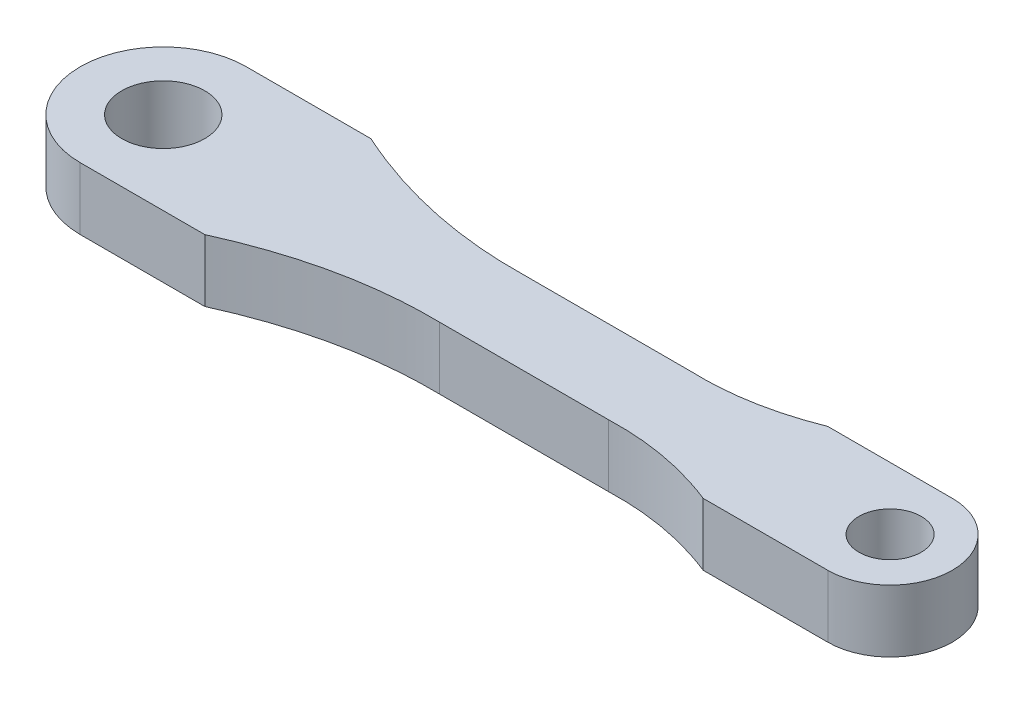
ISO-10303-21;
HEADER;
FILE_DESCRIPTION(('STEP AP214'),'2;1');
FILE_NAME('part.step','',(''),(''),'','','');
FILE_SCHEMA(('AUTOMOTIVE_DESIGN { 1 0 10303 214 1 1 1 1 }'));
ENDSEC;
DATA;
#1=APPLICATION_CONTEXT('core data for automotive mechanical design processes');
#2=APPLICATION_PROTOCOL_DEFINITION('international standard','automotive_design',2000,#1);
#3=PRODUCT_CONTEXT('',#1,'mechanical');
#4=PRODUCT('Part','Part','',(#3));
#5=PRODUCT_RELATED_PRODUCT_CATEGORY('part','',(#4));
#6=PRODUCT_DEFINITION_FORMATION('','',#4);
#7=PRODUCT_DEFINITION_CONTEXT('part definition',#1,'design');
#8=PRODUCT_DEFINITION('design','',#6,#7);
#9=PRODUCT_DEFINITION_SHAPE('','',#8);
#10=(LENGTH_UNIT() NAMED_UNIT(*) SI_UNIT(.MILLI.,.METRE.));
#11=(NAMED_UNIT(*) PLANE_ANGLE_UNIT() SI_UNIT($,.RADIAN.));
#12=(NAMED_UNIT(*) SI_UNIT($,.STERADIAN.) SOLID_ANGLE_UNIT());
#13=UNCERTAINTY_MEASURE_WITH_UNIT(LENGTH_MEASURE(1.E-05),#10,'distance_accuracy_value','');
#14=(GEOMETRIC_REPRESENTATION_CONTEXT(3) GLOBAL_UNCERTAINTY_ASSIGNED_CONTEXT((#13)) GLOBAL_UNIT_ASSIGNED_CONTEXT((#10,
#11,#12)) REPRESENTATION_CONTEXT('',''));
#15=CARTESIAN_POINT('',(0.,0.,0.));
#16=DIRECTION('',(0.,0.,1.));
#17=DIRECTION('',(1.,0.,0.));
#18=AXIS2_PLACEMENT_3D('',#15,#16,#17);
#19=CARTESIAN_POINT('',(-6.87412296810429,3.,2.45795015237386));
#20=DIRECTION('',(0.,1.,0.));
#21=DIRECTION('',(0.,0.,1.));
#22=AXIS2_PLACEMENT_3D('',#19,#20,#21);
#23=PLANE('',#22);
#24=CARTESIAN_POINT('',(-17.5,3.,0.));
#25=DIRECTION('',(0.,1.,0.));
#26=DIRECTION('',(0.,0.,1.));
#27=AXIS2_PLACEMENT_3D('',#24,#25,#26);
#28=CIRCLE('',#27,2.);
#29=CARTESIAN_POINT('',(-17.5,3.,2.));
#30=VERTEX_POINT('',#29);
#31=EDGE_CURVE('E184',#30,#30,#28,.T.);
#32=ORIENTED_EDGE('',*,*,#31,.F.);
#33=EDGE_LOOP('',(#32));
#34=FACE_BOUND('',#33,.T.);
#35=CARTESIAN_POINT('',(-11.5,3.,4.));
#36=CARTESIAN_POINT('',(-8.43186404696426,3.,2.61060020313792));
#37=CARTESIAN_POINT('',(-5.33216395669908,3.,1.9439335365257));
#38=CARTESIAN_POINT('',(-2.20089973384435,3.,2.));
#39=B_SPLINE_CURVE_WITH_KNOTS('',3,(#35,#36,#37,#38),.UNSPECIFIED.,.F.,.F.,(4,4),(0.,
0.616300928201394),.UNSPECIFIED.);
#40=CARTESIAN_POINT('',(-11.5,3.,4.));
#41=VERTEX_POINT('',#40);
#42=CARTESIAN_POINT('',(-2.20089973384435,3.,1.99999999999955));
#43=VERTEX_POINT('',#42);
#44=EDGE_CURVE('E232',#41,#43,#39,.T.);
#45=ORIENTED_EDGE('',*,*,#44,.T.);
#46=DIRECTION('',(1.,0.,0.));
#47=VECTOR('',#46,1.);
#48=CARTESIAN_POINT('',(-2.20089973384435,3.,1.99999999999955));
#49=LINE('',#48,#47);
#50=CARTESIAN_POINT('',(5.94735140343219,3.,2.));
#51=VERTEX_POINT('',#50);
#52=EDGE_CURVE('E124',#43,#51,#49,.T.);
#53=ORIENTED_EDGE('',*,*,#52,.T.);
#54=CARTESIAN_POINT('',(5.94735140343219,3.,2.));
#55=CARTESIAN_POINT('',(7.82226645626251,3.,1.93643550916698));
#56=CARTESIAN_POINT('',(9.67314932223426,3.,2.26976884246729));
#57=CARTESIAN_POINT('',(11.5,3.,3.));
#58=B_SPLINE_CURVE_WITH_KNOTS('',3,(#54,#55,#56,#57),.UNSPECIFIED.,.F.,.F.,(4,4),(0.,
0.698718255578415),.UNSPECIFIED.);
#59=CARTESIAN_POINT('',(11.5,3.,3.));
#60=VERTEX_POINT('',#59);
#61=EDGE_CURVE('E269',#51,#60,#58,.T.);
#62=ORIENTED_EDGE('',*,*,#61,.T.);
#63=DIRECTION('',(1.,0.,0.));
#64=VECTOR('',#63,1.);
#65=CARTESIAN_POINT('',(11.5,3.,3.));
#66=LINE('',#65,#64);
#67=CARTESIAN_POINT('',(17.5,3.,3.));
#68=VERTEX_POINT('',#67);
#69=EDGE_CURVE('E289',#60,#68,#66,.T.);
#70=ORIENTED_EDGE('',*,*,#69,.T.);
#71=CARTESIAN_POINT('',(17.5,3.,0.));
#72=DIRECTION('',(0.,1.,0.));
#73=DIRECTION('',(0.,0.,1.));
#74=AXIS2_PLACEMENT_3D('',#71,#72,#73);
#75=CIRCLE('',#74,3.);
#76=CARTESIAN_POINT('',(17.5,3.,-3.));
#77=VERTEX_POINT('',#76);
#78=EDGE_CURVE('E285',#68,#77,#75,.T.);
#79=ORIENTED_EDGE('',*,*,#78,.T.);
#80=DIRECTION('',(-1.,0.,0.));
#81=VECTOR('',#80,1.);
#82=CARTESIAN_POINT('',(11.5,3.,-3.));
#83=LINE('',#82,#81);
#84=CARTESIAN_POINT('',(11.5,3.,-3.));
#85=VERTEX_POINT('',#84);
#86=EDGE_CURVE('E288',#77,#85,#83,.T.);
#87=ORIENTED_EDGE('',*,*,#86,.T.);
#88=CARTESIAN_POINT('',(11.5,3.,-3.));
#89=CARTESIAN_POINT('',(9.67314932223425,3.,-2.26976884246728));
#90=CARTESIAN_POINT('',(7.82226645626251,3.,-1.93643550916698));
#91=CARTESIAN_POINT('',(5.94735140343219,3.,-2.));
#92=B_SPLINE_CURVE_WITH_KNOTS('',3,(#88,#89,#90,#91),.UNSPECIFIED.,.F.,.F.,(4,4),(0.,
0.698718255578415),.UNSPECIFIED.);
#93=CARTESIAN_POINT('',(5.94735140343219,3.,-2.));
#94=VERTEX_POINT('',#93);
#95=EDGE_CURVE('E293',#85,#94,#92,.T.);
#96=ORIENTED_EDGE('',*,*,#95,.T.);
#97=DIRECTION('',(-1.,0.,0.));
#98=VECTOR('',#97,1.);
#99=CARTESIAN_POINT('',(-2.20089973384435,3.,-1.99999999999955));
#100=LINE('',#99,#98);
#101=CARTESIAN_POINT('',(-2.20089973384435,3.,-2.));
#102=VERTEX_POINT('',#101);
#103=EDGE_CURVE('E303',#94,#102,#100,.T.);
#104=ORIENTED_EDGE('',*,*,#103,.T.);
#105=CARTESIAN_POINT('',(-2.20089973384435,3.,-2.));
#106=CARTESIAN_POINT('',(-5.33216395669908,3.,-1.9439335365257));
#107=CARTESIAN_POINT('',(-8.43186404696425,3.,-2.61060020313793));
#108=CARTESIAN_POINT('',(-11.5,3.,-4.));
#109=B_SPLINE_CURVE_WITH_KNOTS('',3,(#105,#106,#107,#108),.UNSPECIFIED.,.F.,.F.,(4,4),(0.,
0.616300928201394),.UNSPECIFIED.);
#110=CARTESIAN_POINT('',(-11.5,3.,-4.));
#111=VERTEX_POINT('',#110);
#112=EDGE_CURVE('E155',#102,#111,#109,.T.);
#113=ORIENTED_EDGE('',*,*,#112,.T.);
#114=DIRECTION('',(-1.,0.,0.));
#115=VECTOR('',#114,1.);
#116=CARTESIAN_POINT('',(-17.5,3.,-4.));
#117=LINE('',#116,#115);
#118=CARTESIAN_POINT('',(-17.5,3.,-4.));
#119=VERTEX_POINT('',#118);
#120=EDGE_CURVE('E149',#111,#119,#117,.T.);
#121=ORIENTED_EDGE('',*,*,#120,.T.);
#122=CARTESIAN_POINT('',(-17.5,3.,0.));
#123=DIRECTION('',(0.,1.,0.));
#124=DIRECTION('',(0.,0.,1.));
#125=AXIS2_PLACEMENT_3D('',#122,#123,#124);
#126=CIRCLE('',#125,4.);
#127=CARTESIAN_POINT('',(-17.5,3.,4.));
#128=VERTEX_POINT('',#127);
#129=EDGE_CURVE('E153',#119,#128,#126,.T.);
#130=ORIENTED_EDGE('',*,*,#129,.T.);
#131=DIRECTION('',(1.,0.,0.));
#132=VECTOR('',#131,1.);
#133=CARTESIAN_POINT('',(-17.5,3.,4.));
#134=LINE('',#133,#132);
#135=EDGE_CURVE('E69',#128,#41,#134,.T.);
#136=ORIENTED_EDGE('',*,*,#135,.T.);
#137=EDGE_LOOP('',(#45,#53,#62,#70,#79,#87,#96,#104,#113,#121,#130,#136));
#138=FACE_BOUND('',#137,.T.);
#139=CARTESIAN_POINT('',(17.5,3.,0.));
#140=DIRECTION('',(0.,1.,0.));
#141=DIRECTION('',(0.,0.,1.));
#142=AXIS2_PLACEMENT_3D('',#139,#140,#141);
#143=CIRCLE('',#142,1.5);
#144=CARTESIAN_POINT('',(17.5,3.,1.5));
#145=VERTEX_POINT('',#144);
#146=EDGE_CURVE('E346',#145,#145,#143,.T.);
#147=ORIENTED_EDGE('',*,*,#146,.F.);
#148=EDGE_LOOP('',(#147));
#149=FACE_BOUND('',#148,.T.);
#150=ADVANCED_FACE('F50',(#34,#138,#149),#23,.T.);
#151=CARTESIAN_POINT('',(-6.87412296810429,0.,2.45795015237386));
#152=DIRECTION('',(0.,1.,0.));
#153=DIRECTION('',(0.,0.,1.));
#154=AXIS2_PLACEMENT_3D('',#151,#152,#153);
#155=PLANE('',#154);
#156=CARTESIAN_POINT('',(-11.5,0.,4.));
#157=CARTESIAN_POINT('',(-8.43186404696426,0.,2.61060020313792));
#158=CARTESIAN_POINT('',(-5.33216395669908,0.,1.9439335365257));
#159=CARTESIAN_POINT('',(-2.20089973384435,0.,2.));
#160=B_SPLINE_CURVE_WITH_KNOTS('',3,(#156,#157,#158,#159),.UNSPECIFIED.,.F.,.F.,(4,4),(0.,
0.616300928201394),.UNSPECIFIED.);
#161=CARTESIAN_POINT('',(-11.5,0.,4.));
#162=VERTEX_POINT('',#161);
#163=CARTESIAN_POINT('',(-2.20089973384435,0.,1.99999999999955));
#164=VERTEX_POINT('',#163);
#165=EDGE_CURVE('E177',#162,#164,#160,.T.);
#166=ORIENTED_EDGE('',*,*,#165,.F.);
#167=DIRECTION('',(1.,0.,0.));
#168=VECTOR('',#167,1.);
#169=CARTESIAN_POINT('',(-17.5,0.,4.));
#170=LINE('',#169,#168);
#171=CARTESIAN_POINT('',(-17.5,0.,4.));
#172=VERTEX_POINT('',#171);
#173=EDGE_CURVE('E116',#172,#162,#170,.T.);
#174=ORIENTED_EDGE('',*,*,#173,.F.);
#175=CARTESIAN_POINT('',(-17.5,0.,0.));
#176=DIRECTION('',(0.,1.,0.));
#177=DIRECTION('',(0.,0.,1.));
#178=AXIS2_PLACEMENT_3D('',#175,#176,#177);
#179=CIRCLE('',#178,4.);
#180=CARTESIAN_POINT('',(-17.5,0.,-4.));
#181=VERTEX_POINT('',#180);
#182=EDGE_CURVE('E110',#181,#172,#179,.T.);
#183=ORIENTED_EDGE('',*,*,#182,.F.);
#184=DIRECTION('',(-1.,0.,0.));
#185=VECTOR('',#184,1.);
#186=CARTESIAN_POINT('',(-17.5,0.,-4.));
#187=LINE('',#186,#185);
#188=CARTESIAN_POINT('',(-11.5,0.,-4.));
#189=VERTEX_POINT('',#188);
#190=EDGE_CURVE('E164',#189,#181,#187,.T.);
#191=ORIENTED_EDGE('',*,*,#190,.F.);
#192=CARTESIAN_POINT('',(-2.20089973384435,0.,-2.));
#193=CARTESIAN_POINT('',(-5.33216395669908,0.,-1.9439335365257));
#194=CARTESIAN_POINT('',(-8.43186404696425,0.,-2.61060020313793));
#195=CARTESIAN_POINT('',(-11.5,0.,-4.));
#196=B_SPLINE_CURVE_WITH_KNOTS('',3,(#192,#193,#194,#195),.UNSPECIFIED.,.F.,.F.,(4,4),(0.,
0.616300928201394),.UNSPECIFIED.);
#197=CARTESIAN_POINT('',(-2.20089973384435,0.,-2.));
#198=VERTEX_POINT('',#197);
#199=EDGE_CURVE('E218',#198,#189,#196,.T.);
#200=ORIENTED_EDGE('',*,*,#199,.F.);
#201=DIRECTION('',(-1.,0.,0.));
#202=VECTOR('',#201,1.);
#203=CARTESIAN_POINT('',(-2.20089973384435,0.,-1.99999999999955));
#204=LINE('',#203,#202);
#205=CARTESIAN_POINT('',(5.94735140343219,0.,-2.));
#206=VERTEX_POINT('',#205);
#207=EDGE_CURVE('E212',#206,#198,#204,.T.);
#208=ORIENTED_EDGE('',*,*,#207,.F.);
#209=CARTESIAN_POINT('',(11.5,0.,-3.));
#210=CARTESIAN_POINT('',(9.67314932223425,0.,-2.26976884246728));
#211=CARTESIAN_POINT('',(7.82226645626251,0.,-1.93643550916698));
#212=CARTESIAN_POINT('',(5.94735140343219,0.,-2.));
#213=B_SPLINE_CURVE_WITH_KNOTS('',3,(#209,#210,#211,#212),.UNSPECIFIED.,.F.,.F.,(4,4),(0.,
0.698718255578415),.UNSPECIFIED.);
#214=CARTESIAN_POINT('',(11.5,0.,-3.));
#215=VERTEX_POINT('',#214);
#216=EDGE_CURVE('E207',#215,#206,#213,.T.);
#217=ORIENTED_EDGE('',*,*,#216,.F.);
#218=DIRECTION('',(-1.,0.,0.));
#219=VECTOR('',#218,1.);
#220=CARTESIAN_POINT('',(11.5,0.,-3.));
#221=LINE('',#220,#219);
#222=CARTESIAN_POINT('',(17.5,0.,-3.));
#223=VERTEX_POINT('',#222);
#224=EDGE_CURVE('E204',#223,#215,#221,.T.);
#225=ORIENTED_EDGE('',*,*,#224,.F.);
#226=CARTESIAN_POINT('',(17.5,0.,0.));
#227=DIRECTION('',(0.,1.,0.));
#228=DIRECTION('',(0.,0.,1.));
#229=AXIS2_PLACEMENT_3D('',#226,#227,#228);
#230=CIRCLE('',#229,3.);
#231=CARTESIAN_POINT('',(17.5,0.,3.));
#232=VERTEX_POINT('',#231);
#233=EDGE_CURVE('E201',#232,#223,#230,.T.);
#234=ORIENTED_EDGE('',*,*,#233,.F.);
#235=DIRECTION('',(1.,0.,0.));
#236=VECTOR('',#235,1.);
#237=CARTESIAN_POINT('',(11.5,0.,3.));
#238=LINE('',#237,#236);
#239=CARTESIAN_POINT('',(11.5,0.,3.));
#240=VERTEX_POINT('',#239);
#241=EDGE_CURVE('E195',#240,#232,#238,.T.);
#242=ORIENTED_EDGE('',*,*,#241,.F.);
#243=CARTESIAN_POINT('',(5.94735140343219,0.,2.));
#244=CARTESIAN_POINT('',(7.82226645626251,0.,1.93643550916698));
#245=CARTESIAN_POINT('',(9.67314932223426,0.,2.26976884246729));
#246=CARTESIAN_POINT('',(11.5,0.,3.));
#247=B_SPLINE_CURVE_WITH_KNOTS('',3,(#243,#244,#245,#246),.UNSPECIFIED.,.F.,.F.,(4,4),(0.,
0.698718255578415),.UNSPECIFIED.);
#248=CARTESIAN_POINT('',(5.94735140343219,0.,2.));
#249=VERTEX_POINT('',#248);
#250=EDGE_CURVE('E190',#249,#240,#247,.T.);
#251=ORIENTED_EDGE('',*,*,#250,.F.);
#252=DIRECTION('',(1.,0.,0.));
#253=VECTOR('',#252,1.);
#254=CARTESIAN_POINT('',(-2.20089973384435,0.,1.99999999999955));
#255=LINE('',#254,#253);
#256=EDGE_CURVE('E183',#164,#249,#255,.T.);
#257=ORIENTED_EDGE('',*,*,#256,.F.);
#258=EDGE_LOOP('',(#166,#174,#183,#191,#200,#208,#217,#225,#234,#242,#251,#257));
#259=FACE_BOUND('',#258,.T.);
#260=CARTESIAN_POINT('',(-17.5,0.,0.));
#261=DIRECTION('',(0.,1.,0.));
#262=DIRECTION('',(0.,0.,1.));
#263=AXIS2_PLACEMENT_3D('',#260,#261,#262);
#264=CIRCLE('',#263,2.);
#265=CARTESIAN_POINT('',(-17.5,0.,2.));
#266=VERTEX_POINT('',#265);
#267=EDGE_CURVE('E339',#266,#266,#264,.T.);
#268=ORIENTED_EDGE('',*,*,#267,.T.);
#269=EDGE_LOOP('',(#268));
#270=FACE_BOUND('',#269,.T.);
#271=CARTESIAN_POINT('',(17.5,0.,0.));
#272=DIRECTION('',(0.,1.,0.));
#273=DIRECTION('',(0.,0.,1.));
#274=AXIS2_PLACEMENT_3D('',#271,#272,#273);
#275=CIRCLE('',#274,1.5);
#276=CARTESIAN_POINT('',(17.5,0.,1.5));
#277=VERTEX_POINT('',#276);
#278=EDGE_CURVE('E350',#277,#277,#275,.T.);
#279=ORIENTED_EDGE('',*,*,#278,.T.);
#280=EDGE_LOOP('',(#279));
#281=FACE_BOUND('',#280,.T.);
#282=ADVANCED_FACE('F273',(#259,#270,#281),#155,.F.);
#283=DIRECTION('',(0.,-1.,0.));
#284=VECTOR('',#283,1.);
#285=SURFACE_OF_LINEAR_EXTRUSION('',#39,#284);
#286=ORIENTED_EDGE('',*,*,#165,.T.);
#287=DIRECTION('',(0.,-1.,0.));
#288=VECTOR('',#287,1.);
#289=CARTESIAN_POINT('',(-2.20089973384435,3.,1.99999999999955));
#290=LINE('',#289,#288);
#291=EDGE_CURVE('E11',#43,#164,#290,.T.);
#292=ORIENTED_EDGE('',*,*,#291,.F.);
#293=ORIENTED_EDGE('',*,*,#44,.F.);
#294=DIRECTION('',(0.,-1.,0.));
#295=VECTOR('',#294,1.);
#296=CARTESIAN_POINT('',(-11.5,3.,4.));
#297=LINE('',#296,#295);
#298=EDGE_CURVE('E173',#41,#162,#297,.T.);
#299=ORIENTED_EDGE('',*,*,#298,.T.);
#300=EDGE_LOOP('',(#286,#292,#293,#299));
#301=FACE_BOUND('',#300,.T.);
#302=ADVANCED_FACE('F52',(#301),#285,.F.);
#303=CARTESIAN_POINT('',(-2.20089973384435,3.,1.99999999999955));
#304=DIRECTION('',(0.,0.,-1.));
#305=DIRECTION('',(-1.,0.,0.));
#306=AXIS2_PLACEMENT_3D('',#303,#304,#305);
#307=PLANE('',#306);
#308=ORIENTED_EDGE('',*,*,#256,.T.);
#309=DIRECTION('',(0.,-1.,0.));
#310=VECTOR('',#309,1.);
#311=CARTESIAN_POINT('',(5.94735140343219,3.,2.));
#312=LINE('',#311,#310);
#313=EDGE_CURVE('E61',#51,#249,#312,.T.);
#314=ORIENTED_EDGE('',*,*,#313,.F.);
#315=ORIENTED_EDGE('',*,*,#52,.F.);
#316=ORIENTED_EDGE('',*,*,#291,.T.);
#317=EDGE_LOOP('',(#308,#314,#315,#316));
#318=FACE_BOUND('',#317,.T.);
#319=ADVANCED_FACE('F324',(#318),#307,.F.);
#320=DIRECTION('',(0.,-1.,0.));
#321=VECTOR('',#320,1.);
#322=SURFACE_OF_LINEAR_EXTRUSION('',#58,#321);
#323=ORIENTED_EDGE('',*,*,#250,.T.);
#324=DIRECTION('',(0.,-1.,0.));
#325=VECTOR('',#324,1.);
#326=CARTESIAN_POINT('',(11.5,3.,3.));
#327=LINE('',#326,#325);
#328=EDGE_CURVE('E259',#60,#240,#327,.T.);
#329=ORIENTED_EDGE('',*,*,#328,.F.);
#330=ORIENTED_EDGE('',*,*,#61,.F.);
#331=ORIENTED_EDGE('',*,*,#313,.T.);
#332=EDGE_LOOP('',(#323,#329,#330,#331));
#333=FACE_BOUND('',#332,.T.);
#334=ADVANCED_FACE('F267',(#333),#322,.F.);
#335=CARTESIAN_POINT('',(11.5,3.,3.));
#336=DIRECTION('',(0.,0.,-1.));
#337=DIRECTION('',(-1.,0.,0.));
#338=AXIS2_PLACEMENT_3D('',#335,#336,#337);
#339=PLANE('',#338);
#340=ORIENTED_EDGE('',*,*,#241,.T.);
#341=DIRECTION('',(0.,-1.,0.));
#342=VECTOR('',#341,1.);
#343=CARTESIAN_POINT('',(17.5,3.,3.));
#344=LINE('',#343,#342);
#345=EDGE_CURVE('E255',#68,#232,#344,.T.);
#346=ORIENTED_EDGE('',*,*,#345,.F.);
#347=ORIENTED_EDGE('',*,*,#69,.F.);
#348=ORIENTED_EDGE('',*,*,#328,.T.);
#349=EDGE_LOOP('',(#340,#346,#347,#348));
#350=FACE_BOUND('',#349,.T.);
#351=ADVANCED_FACE('F279',(#350),#339,.F.);
#352=CARTESIAN_POINT('',(17.5,3.,0.));
#353=DIRECTION('',(0.,-1.,0.));
#354=DIRECTION('',(0.,0.,-1.));
#355=AXIS2_PLACEMENT_3D('',#352,#353,#354);
#356=CYLINDRICAL_SURFACE('',#355,3.);
#357=ORIENTED_EDGE('',*,*,#233,.T.);
#358=DIRECTION('',(0.,-1.,0.));
#359=VECTOR('',#358,1.);
#360=CARTESIAN_POINT('',(17.5,3.,-3.));
#361=LINE('',#360,#359);
#362=EDGE_CURVE('E251',#77,#223,#361,.T.);
#363=ORIENTED_EDGE('',*,*,#362,.F.);
#364=ORIENTED_EDGE('',*,*,#78,.F.);
#365=ORIENTED_EDGE('',*,*,#345,.T.);
#366=EDGE_LOOP('',(#357,#363,#364,#365));
#367=FACE_BOUND('',#366,.T.);
#368=ADVANCED_FACE('F283',(#367),#356,.T.);
#369=CARTESIAN_POINT('',(11.5,3.,-3.));
#370=DIRECTION('',(0.,0.,1.));
#371=DIRECTION('',(1.,0.,0.));
#372=AXIS2_PLACEMENT_3D('',#369,#370,#371);
#373=PLANE('',#372);
#374=ORIENTED_EDGE('',*,*,#224,.T.);
#375=DIRECTION('',(0.,-1.,0.));
#376=VECTOR('',#375,1.);
#377=CARTESIAN_POINT('',(11.5,3.,-3.));
#378=LINE('',#377,#376);
#379=EDGE_CURVE('E247',#85,#215,#378,.T.);
#380=ORIENTED_EDGE('',*,*,#379,.F.);
#381=ORIENTED_EDGE('',*,*,#86,.F.);
#382=ORIENTED_EDGE('',*,*,#362,.T.);
#383=EDGE_LOOP('',(#374,#380,#381,#382));
#384=FACE_BOUND('',#383,.T.);
#385=ADVANCED_FACE('F313',(#384),#373,.F.);
#386=DIRECTION('',(0.,-1.,0.));
#387=VECTOR('',#386,1.);
#388=SURFACE_OF_LINEAR_EXTRUSION('',#92,#387);
#389=ORIENTED_EDGE('',*,*,#216,.T.);
#390=DIRECTION('',(0.,-1.,0.));
#391=VECTOR('',#390,1.);
#392=CARTESIAN_POINT('',(5.94735140343219,3.,-2.));
#393=LINE('',#392,#391);
#394=EDGE_CURVE('E243',#94,#206,#393,.T.);
#395=ORIENTED_EDGE('',*,*,#394,.F.);
#396=ORIENTED_EDGE('',*,*,#95,.F.);
#397=ORIENTED_EDGE('',*,*,#379,.T.);
#398=EDGE_LOOP('',(#389,#395,#396,#397));
#399=FACE_BOUND('',#398,.T.);
#400=ADVANCED_FACE('F308',(#399),#388,.F.);
#401=CARTESIAN_POINT('',(-2.20089973384435,3.,-1.99999999999955));
#402=DIRECTION('',(0.,0.,1.));
#403=DIRECTION('',(1.,0.,0.));
#404=AXIS2_PLACEMENT_3D('',#401,#402,#403);
#405=PLANE('',#404);
#406=ORIENTED_EDGE('',*,*,#207,.T.);
#407=DIRECTION('',(0.,-1.,0.));
#408=VECTOR('',#407,1.);
#409=CARTESIAN_POINT('',(-2.20089973384435,3.,-2.));
#410=LINE('',#409,#408);
#411=EDGE_CURVE('E239',#102,#198,#410,.T.);
#412=ORIENTED_EDGE('',*,*,#411,.F.);
#413=ORIENTED_EDGE('',*,*,#103,.F.);
#414=ORIENTED_EDGE('',*,*,#394,.T.);
#415=EDGE_LOOP('',(#406,#412,#413,#414));
#416=FACE_BOUND('',#415,.T.);
#417=ADVANCED_FACE('F312',(#416),#405,.F.);
#418=DIRECTION('',(0.,-1.,0.));
#419=VECTOR('',#418,1.);
#420=SURFACE_OF_LINEAR_EXTRUSION('',#109,#419);
#421=ORIENTED_EDGE('',*,*,#199,.T.);
#422=DIRECTION('',(0.,-1.,0.));
#423=VECTOR('',#422,1.);
#424=CARTESIAN_POINT('',(-11.5,3.,-4.));
#425=LINE('',#424,#423);
#426=EDGE_CURVE('E166',#111,#189,#425,.T.);
#427=ORIENTED_EDGE('',*,*,#426,.F.);
#428=ORIENTED_EDGE('',*,*,#112,.F.);
#429=ORIENTED_EDGE('',*,*,#411,.T.);
#430=EDGE_LOOP('',(#421,#427,#428,#429));
#431=FACE_BOUND('',#430,.T.);
#432=ADVANCED_FACE('F378',(#431),#420,.F.);
#433=CARTESIAN_POINT('',(-17.5,3.,-4.));
#434=DIRECTION('',(0.,0.,1.));
#435=DIRECTION('',(1.,0.,0.));
#436=AXIS2_PLACEMENT_3D('',#433,#434,#435);
#437=PLANE('',#436);
#438=ORIENTED_EDGE('',*,*,#190,.T.);
#439=DIRECTION('',(0.,-1.,0.));
#440=VECTOR('',#439,1.);
#441=CARTESIAN_POINT('',(-17.5,3.,-4.));
#442=LINE('',#441,#440);
#443=EDGE_CURVE('E161',#119,#181,#442,.T.);
#444=ORIENTED_EDGE('',*,*,#443,.F.);
#445=ORIENTED_EDGE('',*,*,#120,.F.);
#446=ORIENTED_EDGE('',*,*,#426,.T.);
#447=EDGE_LOOP('',(#438,#444,#445,#446));
#448=FACE_BOUND('',#447,.T.);
#449=ADVANCED_FACE('F162',(#448),#437,.F.);
#450=CARTESIAN_POINT('',(-17.5,3.,0.));
#451=DIRECTION('',(0.,-1.,0.));
#452=DIRECTION('',(0.,0.,-1.));
#453=AXIS2_PLACEMENT_3D('',#450,#451,#452);
#454=CYLINDRICAL_SURFACE('',#453,4.);
#455=ORIENTED_EDGE('',*,*,#182,.T.);
#456=DIRECTION('',(0.,-1.,0.));
#457=VECTOR('',#456,1.);
#458=CARTESIAN_POINT('',(-17.5,3.,4.));
#459=LINE('',#458,#457);
#460=EDGE_CURVE('E167',#128,#172,#459,.T.);
#461=ORIENTED_EDGE('',*,*,#460,.F.);
#462=ORIENTED_EDGE('',*,*,#129,.F.);
#463=ORIENTED_EDGE('',*,*,#443,.T.);
#464=EDGE_LOOP('',(#455,#461,#462,#463));
#465=FACE_BOUND('',#464,.T.);
#466=ADVANCED_FACE('F169',(#465),#454,.T.);
#467=CARTESIAN_POINT('',(-17.5,3.,4.));
#468=DIRECTION('',(0.,0.,-1.));
#469=DIRECTION('',(-1.,0.,0.));
#470=AXIS2_PLACEMENT_3D('',#467,#468,#469);
#471=PLANE('',#470);
#472=ORIENTED_EDGE('',*,*,#173,.T.);
#473=ORIENTED_EDGE('',*,*,#298,.F.);
#474=ORIENTED_EDGE('',*,*,#135,.F.);
#475=ORIENTED_EDGE('',*,*,#460,.T.);
#476=EDGE_LOOP('',(#472,#473,#474,#475));
#477=FACE_BOUND('',#476,.T.);
#478=ADVANCED_FACE('F372',(#477),#471,.F.);
#479=CARTESIAN_POINT('',(-17.5,3.,0.));
#480=DIRECTION('',(0.,-1.,0.));
#481=DIRECTION('',(0.,0.,-1.));
#482=AXIS2_PLACEMENT_3D('',#479,#480,#481);
#483=CYLINDRICAL_SURFACE('',#482,2.);
#484=ORIENTED_EDGE('',*,*,#31,.T.);
#485=EDGE_LOOP('',(#484));
#486=FACE_BOUND('',#485,.T.);
#487=ORIENTED_EDGE('',*,*,#267,.F.);
#488=EDGE_LOOP('',(#487));
#489=FACE_BOUND('',#488,.T.);
#490=ADVANCED_FACE('F369',(#486,#489),#483,.F.);
#491=CARTESIAN_POINT('',(17.5,3.,0.));
#492=DIRECTION('',(0.,-1.,0.));
#493=DIRECTION('',(0.,0.,-1.));
#494=AXIS2_PLACEMENT_3D('',#491,#492,#493);
#495=CYLINDRICAL_SURFACE('',#494,1.5);
#496=ORIENTED_EDGE('',*,*,#146,.T.);
#497=EDGE_LOOP('',(#496));
#498=FACE_BOUND('',#497,.T.);
#499=ORIENTED_EDGE('',*,*,#278,.F.);
#500=EDGE_LOOP('',(#499));
#501=FACE_BOUND('',#500,.T.);
#502=ADVANCED_FACE('F358',(#498,#501),#495,.F.);
#503=CLOSED_SHELL('',(#150,#282,#302,#319,#334,#351,#368,#385,#400,#417,#432,#449,#466,#478,
#490,#502));
#504=MANIFOLD_SOLID_BREP('B2',#503);
#505=ADVANCED_BREP_SHAPE_REPRESENTATION('',(#18,#504),#14);
#506=SHAPE_DEFINITION_REPRESENTATION(#9,#505);
ENDSEC;
END-ISO-10303-21;
